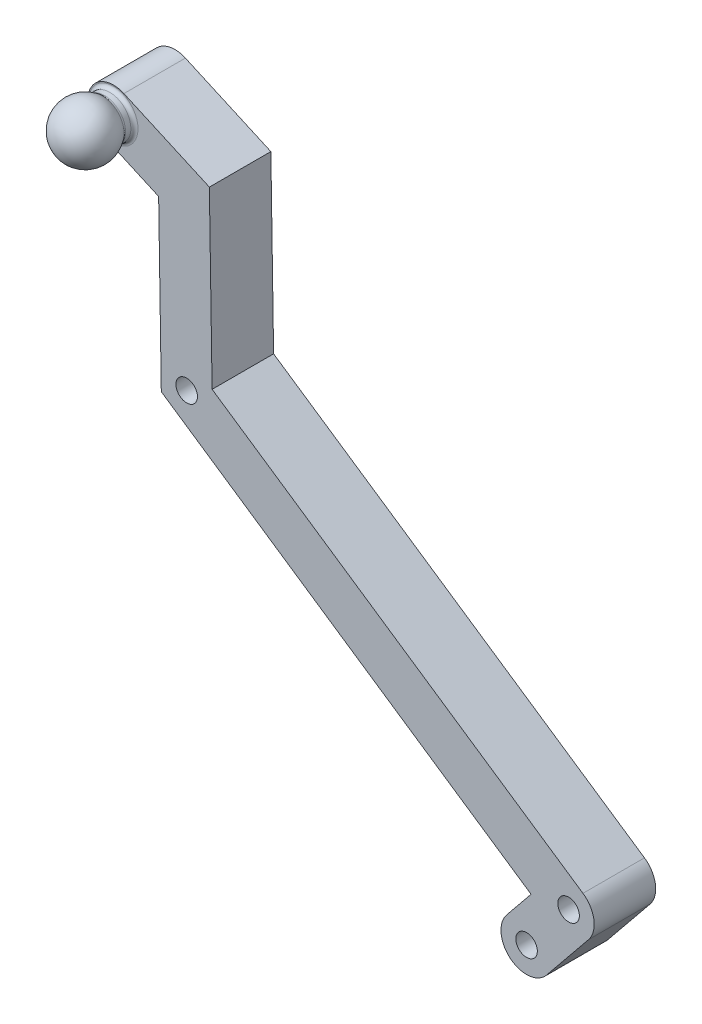
ISO-10303-21;
HEADER;
FILE_DESCRIPTION(('STEP AP214'),'2;1');
FILE_NAME('part.step','',(''),(''),'','','');
FILE_SCHEMA(('AUTOMOTIVE_DESIGN { 1 0 10303 214 1 1 1 1 }'));
ENDSEC;
DATA;
#1=APPLICATION_CONTEXT('core data for automotive mechanical design processes');
#2=APPLICATION_PROTOCOL_DEFINITION('international standard','automotive_design',2000,#1);
#3=PRODUCT_CONTEXT('',#1,'mechanical');
#4=PRODUCT('Part','Part','',(#3));
#5=PRODUCT_RELATED_PRODUCT_CATEGORY('part','',(#4));
#6=PRODUCT_DEFINITION_FORMATION('','',#4);
#7=PRODUCT_DEFINITION_CONTEXT('part definition',#1,'design');
#8=PRODUCT_DEFINITION('design','',#6,#7);
#9=PRODUCT_DEFINITION_SHAPE('','',#8);
#10=(LENGTH_UNIT() NAMED_UNIT(*) SI_UNIT(.MILLI.,.METRE.));
#11=(NAMED_UNIT(*) PLANE_ANGLE_UNIT() SI_UNIT($,.RADIAN.));
#12=(NAMED_UNIT(*) SI_UNIT($,.STERADIAN.) SOLID_ANGLE_UNIT());
#13=UNCERTAINTY_MEASURE_WITH_UNIT(LENGTH_MEASURE(1.E-05),#10,'distance_accuracy_value','');
#14=(GEOMETRIC_REPRESENTATION_CONTEXT(3) GLOBAL_UNCERTAINTY_ASSIGNED_CONTEXT((#13)) GLOBAL_UNIT_ASSIGNED_CONTEXT((#10,
#11,#12)) REPRESENTATION_CONTEXT('',''));
#15=CARTESIAN_POINT('',(0.,0.,0.));
#16=DIRECTION('',(0.,0.,1.));
#17=DIRECTION('',(1.,0.,0.));
#18=AXIS2_PLACEMENT_3D('',#15,#16,#17);
#19=CARTESIAN_POINT('',(17.5208334553325,1.65932066397215,-6.));
#20=DIRECTION('',(-0.999875655064383,-0.0157694137357801,0.));
#21=DIRECTION('',(0.0157694137357801,-0.999875655064383,0.));
#22=AXIS2_PLACEMENT_3D('',#19,#20,#21);
#23=PLANE('',#22);
#24=DIRECTION('',(0.0157694137357801,-0.999875655064383,0.));
#25=VECTOR('',#24,1.);
#26=CARTESIAN_POINT('',(17.5208334553325,1.65932066397215,0.));
#27=LINE('',#26,#25);
#28=CARTESIAN_POINT('',(17.2625853569559,18.0338029915893,0.));
#29=VERTEX_POINT('',#28);
#30=CARTESIAN_POINT('',(17.5208334553325,1.65932066397215,0.));
#31=VERTEX_POINT('',#30);
#32=EDGE_CURVE('E154',#29,#31,#27,.T.);
#33=ORIENTED_EDGE('',*,*,#32,.F.);
#34=DIRECTION('',(0.,0.,1.));
#35=VECTOR('',#34,1.);
#36=CARTESIAN_POINT('',(17.2625853569559,18.0338029915893,-6.));
#37=LINE('',#36,#35);
#38=CARTESIAN_POINT('',(17.2625853569559,18.0338029915893,-6.));
#39=VERTEX_POINT('',#38);
#40=EDGE_CURVE('E53',#39,#29,#37,.T.);
#41=ORIENTED_EDGE('',*,*,#40,.F.);
#42=DIRECTION('',(0.0157694137357801,-0.999875655064383,0.));
#43=VECTOR('',#42,1.);
#44=CARTESIAN_POINT('',(17.5208334553325,1.65932066397215,-6.));
#45=LINE('',#44,#43);
#46=CARTESIAN_POINT('',(17.5208334553325,1.65932066397215,-6.));
#47=VERTEX_POINT('',#46);
#48=EDGE_CURVE('E185',#39,#47,#45,.T.);
#49=ORIENTED_EDGE('',*,*,#48,.T.);
#50=DIRECTION('',(0.,0.,1.));
#51=VECTOR('',#50,1.);
#52=CARTESIAN_POINT('',(17.5208334553325,1.65932066397215,-6.));
#53=LINE('',#52,#51);
#54=EDGE_CURVE('E103',#47,#31,#53,.T.);
#55=ORIENTED_EDGE('',*,*,#54,.T.);
#56=EDGE_LOOP('',(#33,#41,#49,#55));
#57=FACE_BOUND('',#56,.T.);
#58=ADVANCED_FACE('F36',(#57),#23,.T.);
#59=CARTESIAN_POINT('',(17.2625853569559,18.0338029915893,-6.));
#60=DIRECTION('',(-0.408273768834411,-0.912859534474908,0.));
#61=DIRECTION('',(0.912859534474908,-0.408273768834411,0.));
#62=AXIS2_PLACEMENT_3D('',#59,#60,#61);
#63=PLANE('',#62);
#64=DIRECTION('',(0.912859534474908,-0.408273768834411,0.));
#65=VECTOR('',#64,1.);
#66=CARTESIAN_POINT('',(17.2625853569559,18.0338029915893,0.));
#67=LINE('',#66,#65);
#68=CARTESIAN_POINT('',(11.8301187262055,20.4634578745604,0.));
#69=VERTEX_POINT('',#68);
#70=EDGE_CURVE('E182',#69,#29,#67,.T.);
#71=ORIENTED_EDGE('',*,*,#70,.F.);
#72=DIRECTION('',(0.,0.,1.));
#73=VECTOR('',#72,1.);
#74=CARTESIAN_POINT('',(11.8301187262055,20.4634578745604,-6.));
#75=LINE('',#74,#73);
#76=CARTESIAN_POINT('',(11.8301187262055,20.4634578745604,-6.));
#77=VERTEX_POINT('',#76);
#78=EDGE_CURVE('E91',#77,#69,#75,.T.);
#79=ORIENTED_EDGE('',*,*,#78,.F.);
#80=DIRECTION('',(0.912859534474908,-0.408273768834411,0.));
#81=VECTOR('',#80,1.);
#82=CARTESIAN_POINT('',(17.2625853569559,18.0338029915893,-6.));
#83=LINE('',#82,#81);
#84=EDGE_CURVE('E144',#77,#39,#83,.T.);
#85=ORIENTED_EDGE('',*,*,#84,.T.);
#86=ORIENTED_EDGE('',*,*,#40,.T.);
#87=EDGE_LOOP('',(#71,#79,#85,#86));
#88=FACE_BOUND('',#87,.T.);
#89=ADVANCED_FACE('F238',(#88),#63,.T.);
#90=CARTESIAN_POINT('',(12.8508031482915,22.7456067107476,-6.));
#91=DIRECTION('',(0.,0.,1.));
#92=DIRECTION('',(1.,0.,0.));
#93=AXIS2_PLACEMENT_3D('',#90,#91,#92);
#94=CYLINDRICAL_SURFACE('',#93,2.5);
#95=CARTESIAN_POINT('',(12.8508031482915,22.7456067107476,0.));
#96=DIRECTION('',(0.,0.,1.));
#97=DIRECTION('',(-1.,0.,0.));
#98=AXIS2_PLACEMENT_3D('',#95,#96,#97);
#99=CIRCLE('',#98,2.5);
#100=CARTESIAN_POINT('',(13.8714875703776,25.0277555469349,0.));
#101=VERTEX_POINT('',#100);
#102=EDGE_CURVE('E131',#101,#69,#99,.T.);
#103=ORIENTED_EDGE('',*,*,#102,.F.);
#104=DIRECTION('',(0.,0.,1.));
#105=VECTOR('',#104,1.);
#106=CARTESIAN_POINT('',(13.8714875703776,25.0277555469349,-6.));
#107=LINE('',#106,#105);
#108=CARTESIAN_POINT('',(13.8714875703776,25.0277555469349,-6.));
#109=VERTEX_POINT('',#108);
#110=EDGE_CURVE('E126',#109,#101,#107,.T.);
#111=ORIENTED_EDGE('',*,*,#110,.F.);
#112=CARTESIAN_POINT('',(12.8508031482915,22.7456067107476,-6.));
#113=DIRECTION('',(0.,0.,1.));
#114=DIRECTION('',(-1.,0.,0.));
#115=AXIS2_PLACEMENT_3D('',#112,#113,#114);
#116=CIRCLE('',#115,2.5);
#117=EDGE_CURVE('E129',#109,#77,#116,.T.);
#118=ORIENTED_EDGE('',*,*,#117,.T.);
#119=ORIENTED_EDGE('',*,*,#78,.T.);
#120=EDGE_LOOP('',(#103,#111,#118,#119));
#121=FACE_BOUND('',#120,.T.);
#122=ADVANCED_FACE('F128',(#121),#94,.T.);
#123=CARTESIAN_POINT('',(13.8714875703776,25.0277555469349,-6.));
#124=DIRECTION('',(0.408273768834411,0.912859534474908,0.));
#125=DIRECTION('',(-0.912859534474908,0.408273768834411,0.));
#126=AXIS2_PLACEMENT_3D('',#123,#124,#125);
#127=PLANE('',#126);
#128=DIRECTION('',(-0.912859534474908,0.408273768834411,0.));
#129=VECTOR('',#128,1.);
#130=CARTESIAN_POINT('',(13.8714875703776,25.0277555469349,0.));
#131=LINE('',#130,#129);
#132=CARTESIAN_POINT('',(22.2117325096706,21.2976052820029,0.));
#133=VERTEX_POINT('',#132);
#134=EDGE_CURVE('E179',#133,#101,#131,.T.);
#135=ORIENTED_EDGE('',*,*,#134,.F.);
#136=DIRECTION('',(0.,0.,1.));
#137=VECTOR('',#136,1.);
#138=CARTESIAN_POINT('',(22.2117325096706,21.2976052820029,-6.));
#139=LINE('',#138,#137);
#140=CARTESIAN_POINT('',(22.2117325096706,21.2976052820029,-6.));
#141=VERTEX_POINT('',#140);
#142=EDGE_CURVE('E136',#141,#133,#139,.T.);
#143=ORIENTED_EDGE('',*,*,#142,.F.);
#144=DIRECTION('',(-0.912859534474908,0.408273768834411,0.));
#145=VECTOR('',#144,1.);
#146=CARTESIAN_POINT('',(13.8714875703776,25.0277555469349,-6.));
#147=LINE('',#146,#145);
#148=EDGE_CURVE('E142',#141,#109,#147,.T.);
#149=ORIENTED_EDGE('',*,*,#148,.T.);
#150=ORIENTED_EDGE('',*,*,#110,.T.);
#151=EDGE_LOOP('',(#135,#143,#149,#150));
#152=FACE_BOUND('',#151,.T.);
#153=ADVANCED_FACE('F146',(#152),#127,.T.);
#154=CARTESIAN_POINT('',(22.2117325096706,21.2976052820029,-6.));
#155=DIRECTION('',(0.999875655064383,0.01576941373578,0.));
#156=DIRECTION('',(-0.01576941373578,0.999875655064383,0.));
#157=AXIS2_PLACEMENT_3D('',#154,#155,#156);
#158=PLANE('',#157);
#159=DIRECTION('',(-0.01576941373578,0.999875655064383,0.));
#160=VECTOR('',#159,1.);
#161=CARTESIAN_POINT('',(22.2117325096706,21.2976052820029,0.));
#162=LINE('',#161,#160);
#163=CARTESIAN_POINT('',(22.4791665446676,4.34067933602787,0.));
#164=VERTEX_POINT('',#163);
#165=EDGE_CURVE('E176',#164,#133,#162,.T.);
#166=ORIENTED_EDGE('',*,*,#165,.F.);
#167=DIRECTION('',(0.,0.,1.));
#168=VECTOR('',#167,1.);
#169=CARTESIAN_POINT('',(22.4791665446676,4.34067933602787,-6.));
#170=LINE('',#169,#168);
#171=CARTESIAN_POINT('',(22.4791665446676,4.34067933602787,-6.));
#172=VERTEX_POINT('',#171);
#173=EDGE_CURVE('E190',#172,#164,#170,.T.);
#174=ORIENTED_EDGE('',*,*,#173,.F.);
#175=DIRECTION('',(-0.01576941373578,0.999875655064383,0.));
#176=VECTOR('',#175,1.);
#177=CARTESIAN_POINT('',(22.2117325096706,21.2976052820029,-6.));
#178=LINE('',#177,#176);
#179=EDGE_CURVE('E147',#172,#141,#178,.T.);
#180=ORIENTED_EDGE('',*,*,#179,.T.);
#181=ORIENTED_EDGE('',*,*,#142,.T.);
#182=EDGE_LOOP('',(#166,#174,#180,#181));
#183=FACE_BOUND('',#182,.T.);
#184=ADVANCED_FACE('F267',(#183),#158,.T.);
#185=CARTESIAN_POINT('',(22.4791665446676,4.34067933602787,-6.));
#186=DIRECTION('',(0.560587567527092,0.828095151014699,0.));
#187=DIRECTION('',(-0.828095151014699,0.560587567527092,0.));
#188=AXIS2_PLACEMENT_3D('',#185,#186,#187);
#189=PLANE('',#188);
#190=DIRECTION('',(-0.828095151014699,0.560587567527092,0.));
#191=VECTOR('',#190,1.);
#192=CARTESIAN_POINT('',(22.4791665446676,4.34067933602787,0.));
#193=LINE('',#192,#191);
#194=CARTESIAN_POINT('',(58.6657507144792,-20.1562026611824,0.));
#195=VERTEX_POINT('',#194);
#196=EDGE_CURVE('E173',#195,#164,#193,.T.);
#197=ORIENTED_EDGE('',*,*,#196,.F.);
#198=DIRECTION('',(0.,0.,1.));
#199=VECTOR('',#198,1.);
#200=CARTESIAN_POINT('',(58.6657507144792,-20.1562026611824,-6.));
#201=LINE('',#200,#199);
#202=CARTESIAN_POINT('',(58.6657507144792,-20.1562026611824,-6.));
#203=VERTEX_POINT('',#202);
#204=EDGE_CURVE('E192',#203,#195,#201,.T.);
#205=ORIENTED_EDGE('',*,*,#204,.F.);
#206=DIRECTION('',(-0.828095151014699,0.560587567527092,0.));
#207=VECTOR('',#206,1.);
#208=CARTESIAN_POINT('',(22.4791665446676,4.34067933602787,-6.));
#209=LINE('',#208,#207);
#210=EDGE_CURVE('E149',#203,#172,#209,.T.);
#211=ORIENTED_EDGE('',*,*,#210,.T.);
#212=ORIENTED_EDGE('',*,*,#173,.T.);
#213=EDGE_LOOP('',(#197,#205,#211,#212));
#214=FACE_BOUND('',#213,.T.);
#215=ADVANCED_FACE('F263',(#214),#189,.T.);
#216=CARTESIAN_POINT('',(57.2642817956615,-22.2264405387192,-6.));
#217=DIRECTION('',(0.,0.,1.));
#218=DIRECTION('',(1.,0.,0.));
#219=AXIS2_PLACEMENT_3D('',#216,#217,#218);
#220=CYLINDRICAL_SURFACE('',#219,2.50000000000002);
#221=CARTESIAN_POINT('',(57.2642817956615,-22.2264405387192,0.));
#222=DIRECTION('',(0.,0.,1.));
#223=DIRECTION('',(-1.,0.,0.));
#224=AXIS2_PLACEMENT_3D('',#221,#222,#223);
#225=CIRCLE('',#224,2.50000000000002);
#226=CARTESIAN_POINT('',(59.204495728495,-23.8030095650668,0.));
#227=VERTEX_POINT('',#226);
#228=EDGE_CURVE('E170',#227,#195,#225,.T.);
#229=ORIENTED_EDGE('',*,*,#228,.F.);
#230=DIRECTION('',(0.,0.,1.));
#231=VECTOR('',#230,1.);
#232=CARTESIAN_POINT('',(59.204495728495,-23.8030095650668,-6.));
#233=LINE('',#232,#231);
#234=CARTESIAN_POINT('',(59.204495728495,-23.8030095650668,-6.));
#235=VERTEX_POINT('',#234);
#236=EDGE_CURVE('E194',#235,#227,#233,.T.);
#237=ORIENTED_EDGE('',*,*,#236,.F.);
#238=CARTESIAN_POINT('',(57.2642817956615,-22.2264405387192,-6.));
#239=DIRECTION('',(0.,0.,1.));
#240=DIRECTION('',(-1.,0.,0.));
#241=AXIS2_PLACEMENT_3D('',#238,#239,#240);
#242=CIRCLE('',#241,2.50000000000002);
#243=EDGE_CURVE('E324',#235,#203,#242,.T.);
#244=ORIENTED_EDGE('',*,*,#243,.T.);
#245=ORIENTED_EDGE('',*,*,#204,.T.);
#246=EDGE_LOOP('',(#229,#237,#244,#245));
#247=FACE_BOUND('',#246,.T.);
#248=ADVANCED_FACE('F259',(#247),#220,.T.);
#249=CARTESIAN_POINT('',(59.204495728495,-23.8030095650668,-6.));
#250=DIRECTION('',(0.776085573133398,-0.63062761053906,0.));
#251=DIRECTION('',(0.63062761053906,0.776085573133398,0.));
#252=AXIS2_PLACEMENT_3D('',#249,#250,#251);
#253=PLANE('',#252);
#254=DIRECTION('',(0.63062761053906,0.776085573133398,0.));
#255=VECTOR('',#254,1.);
#256=CARTESIAN_POINT('',(59.204495728495,-23.8030095650668,0.));
#257=LINE('',#256,#255);
#258=CARTESIAN_POINT('',(55.1054162599911,-28.8475657904339,0.));
#259=VERTEX_POINT('',#258);
#260=EDGE_CURVE('E167',#259,#227,#257,.T.);
#261=ORIENTED_EDGE('',*,*,#260,.F.);
#262=DIRECTION('',(0.,0.,1.));
#263=VECTOR('',#262,1.);
#264=CARTESIAN_POINT('',(55.1054162599911,-28.8475657904339,-6.));
#265=LINE('',#264,#263);
#266=CARTESIAN_POINT('',(55.1054162599911,-28.8475657904339,-6.));
#267=VERTEX_POINT('',#266);
#268=EDGE_CURVE('E196',#267,#259,#265,.T.);
#269=ORIENTED_EDGE('',*,*,#268,.F.);
#270=DIRECTION('',(0.63062761053906,0.776085573133398,0.));
#271=VECTOR('',#270,1.);
#272=CARTESIAN_POINT('',(59.204495728495,-23.8030095650668,-6.));
#273=LINE('',#272,#271);
#274=EDGE_CURVE('E317',#267,#235,#273,.T.);
#275=ORIENTED_EDGE('',*,*,#274,.T.);
#276=ORIENTED_EDGE('',*,*,#236,.T.);
#277=EDGE_LOOP('',(#261,#269,#275,#276));
#278=FACE_BOUND('',#277,.T.);
#279=ADVANCED_FACE('F255',(#278),#253,.T.);
#280=CARTESIAN_POINT('',(53.1652023271576,-27.2709967640862,-6.));
#281=DIRECTION('',(0.,0.,1.));
#282=DIRECTION('',(1.,0.,0.));
#283=AXIS2_PLACEMENT_3D('',#280,#281,#282);
#284=CYLINDRICAL_SURFACE('',#283,2.5);
#285=CARTESIAN_POINT('',(53.1652023271576,-27.2709967640862,0.));
#286=DIRECTION('',(0.,0.,1.));
#287=DIRECTION('',(-1.,0.,0.));
#288=AXIS2_PLACEMENT_3D('',#285,#286,#287);
#289=CIRCLE('',#288,2.5);
#290=CARTESIAN_POINT('',(51.2249883943241,-25.6944277377386,0.));
#291=VERTEX_POINT('',#290);
#292=EDGE_CURVE('E164',#291,#259,#289,.T.);
#293=ORIENTED_EDGE('',*,*,#292,.F.);
#294=DIRECTION('',(0.,0.,1.));
#295=VECTOR('',#294,1.);
#296=CARTESIAN_POINT('',(51.2249883943241,-25.6944277377386,-6.));
#297=LINE('',#296,#295);
#298=CARTESIAN_POINT('',(51.2249883943241,-25.6944277377386,-6.));
#299=VERTEX_POINT('',#298);
#300=EDGE_CURVE('E198',#299,#291,#297,.T.);
#301=ORIENTED_EDGE('',*,*,#300,.F.);
#302=CARTESIAN_POINT('',(53.1652023271576,-27.2709967640862,-6.));
#303=DIRECTION('',(0.,0.,1.));
#304=DIRECTION('',(-1.,0.,0.));
#305=AXIS2_PLACEMENT_3D('',#302,#303,#304);
#306=CIRCLE('',#305,2.5);
#307=EDGE_CURVE('E313',#299,#267,#306,.T.);
#308=ORIENTED_EDGE('',*,*,#307,.T.);
#309=ORIENTED_EDGE('',*,*,#268,.T.);
#310=EDGE_LOOP('',(#293,#301,#308,#309));
#311=FACE_BOUND('',#310,.T.);
#312=ADVANCED_FACE('F251',(#311),#284,.T.);
#313=CARTESIAN_POINT('',(51.2249883943241,-25.6944277377386,-6.));
#314=DIRECTION('',(-0.776085573133398,0.630627610539061,0.));
#315=DIRECTION('',(-0.630627610539061,-0.776085573133398,0.));
#316=AXIS2_PLACEMENT_3D('',#313,#314,#315);
#317=PLANE('',#316);
#318=DIRECTION('',(-0.630627610539061,-0.776085573133398,0.));
#319=VECTOR('',#318,1.);
#320=CARTESIAN_POINT('',(51.2249883943241,-25.6944277377386,0.));
#321=LINE('',#320,#319);
#322=CARTESIAN_POINT('',(53.6035446818523,-22.7672434711657,0.));
#323=VERTEX_POINT('',#322);
#324=EDGE_CURVE('E161',#323,#291,#321,.T.);
#325=ORIENTED_EDGE('',*,*,#324,.F.);
#326=DIRECTION('',(0.,0.,1.));
#327=VECTOR('',#326,1.);
#328=CARTESIAN_POINT('',(53.6035446818523,-22.7672434711657,-6.));
#329=LINE('',#328,#327);
#330=CARTESIAN_POINT('',(53.6035446818523,-22.7672434711657,-6.));
#331=VERTEX_POINT('',#330);
#332=EDGE_CURVE('E200',#331,#323,#329,.T.);
#333=ORIENTED_EDGE('',*,*,#332,.F.);
#334=DIRECTION('',(-0.630627610539061,-0.776085573133398,0.));
#335=VECTOR('',#334,1.);
#336=CARTESIAN_POINT('',(51.2249883943241,-25.6944277377386,-6.));
#337=LINE('',#336,#335);
#338=EDGE_CURVE('E329',#331,#299,#337,.T.);
#339=ORIENTED_EDGE('',*,*,#338,.T.);
#340=ORIENTED_EDGE('',*,*,#300,.T.);
#341=EDGE_LOOP('',(#325,#333,#339,#340));
#342=FACE_BOUND('',#341,.T.);
#343=ADVANCED_FACE('F248',(#342),#317,.T.);
#344=CARTESIAN_POINT('',(17.5208334553325,1.65932066397215,-6.));
#345=DIRECTION('',(-0.560587567527093,-0.828095151014699,0.));
#346=DIRECTION('',(0.828095151014699,-0.560587567527093,0.));
#347=AXIS2_PLACEMENT_3D('',#344,#345,#346);
#348=PLANE('',#347);
#349=DIRECTION('',(0.828095151014699,-0.560587567527092,0.));
#350=VECTOR('',#349,1.);
#351=CARTESIAN_POINT('',(17.5208334553325,1.65932066397215,0.));
#352=LINE('',#351,#350);
#353=EDGE_CURVE('E157',#31,#323,#352,.T.);
#354=ORIENTED_EDGE('',*,*,#353,.F.);
#355=ORIENTED_EDGE('',*,*,#54,.F.);
#356=DIRECTION('',(0.828095151014699,-0.560587567527092,0.));
#357=VECTOR('',#356,1.);
#358=CARTESIAN_POINT('',(17.5208334553325,1.65932066397215,-6.));
#359=LINE('',#358,#357);
#360=EDGE_CURVE('E306',#47,#331,#359,.T.);
#361=ORIENTED_EDGE('',*,*,#360,.T.);
#362=ORIENTED_EDGE('',*,*,#332,.T.);
#363=EDGE_LOOP('',(#354,#355,#361,#362));
#364=FACE_BOUND('',#363,.T.);
#365=ADVANCED_FACE('F245',(#364),#348,.T.);
#366=CARTESIAN_POINT('',(12.8508031482915,22.7456067107476,-6.));
#367=DIRECTION('',(0.,0.,-1.));
#368=DIRECTION('',(-1.,0.,0.));
#369=AXIS2_PLACEMENT_3D('',#366,#367,#368);
#370=PLANE('',#369);
#371=CARTESIAN_POINT('',(20.,3.,-6.));
#372=DIRECTION('',(0.,0.,-1.));
#373=DIRECTION('',(-1.,0.,0.));
#374=AXIS2_PLACEMENT_3D('',#371,#372,#373);
#375=CIRCLE('',#374,1.05);
#376=CARTESIAN_POINT('',(18.95,3.,-6.));
#377=VERTEX_POINT('',#376);
#378=EDGE_CURVE('E158',#377,#377,#375,.T.);
#379=ORIENTED_EDGE('',*,*,#378,.F.);
#380=EDGE_LOOP('',(#379));
#381=FACE_BOUND('',#380,.T.);
#382=CARTESIAN_POINT('',(57.2642817956615,-22.2264405387192,-6.));
#383=DIRECTION('',(0.,0.,-1.));
#384=DIRECTION('',(-1.,0.,0.));
#385=AXIS2_PLACEMENT_3D('',#382,#383,#384);
#386=CIRCLE('',#385,1.05);
#387=CARTESIAN_POINT('',(56.2142817956615,-22.2264405387192,-6.));
#388=VERTEX_POINT('',#387);
#389=EDGE_CURVE('E210',#388,#388,#386,.T.);
#390=ORIENTED_EDGE('',*,*,#389,.F.);
#391=EDGE_LOOP('',(#390));
#392=FACE_BOUND('',#391,.T.);
#393=CARTESIAN_POINT('',(53.1652023271576,-27.2709967640862,-6.));
#394=DIRECTION('',(0.,0.,-1.));
#395=DIRECTION('',(-1.,0.,0.));
#396=AXIS2_PLACEMENT_3D('',#393,#394,#395);
#397=CIRCLE('',#396,1.05);
#398=CARTESIAN_POINT('',(52.1152023271576,-27.2709967640862,-6.));
#399=VERTEX_POINT('',#398);
#400=EDGE_CURVE('E206',#399,#399,#397,.T.);
#401=ORIENTED_EDGE('',*,*,#400,.F.);
#402=EDGE_LOOP('',(#401));
#403=FACE_BOUND('',#402,.T.);
#404=ORIENTED_EDGE('',*,*,#48,.F.);
#405=ORIENTED_EDGE('',*,*,#84,.F.);
#406=ORIENTED_EDGE('',*,*,#117,.F.);
#407=ORIENTED_EDGE('',*,*,#148,.F.);
#408=ORIENTED_EDGE('',*,*,#179,.F.);
#409=ORIENTED_EDGE('',*,*,#210,.F.);
#410=ORIENTED_EDGE('',*,*,#243,.F.);
#411=ORIENTED_EDGE('',*,*,#274,.F.);
#412=ORIENTED_EDGE('',*,*,#307,.F.);
#413=ORIENTED_EDGE('',*,*,#338,.F.);
#414=ORIENTED_EDGE('',*,*,#360,.F.);
#415=EDGE_LOOP('',(#404,#405,#406,#407,#408,#409,#410,#411,#412,#413,#414));
#416=FACE_BOUND('',#415,.T.);
#417=ADVANCED_FACE('F140',(#381,#392,#403,#416),#370,.T.);
#418=CARTESIAN_POINT('',(12.8508031482915,22.7456067107476,0.));
#419=DIRECTION('',(0.,0.,-1.));
#420=DIRECTION('',(-1.,0.,0.));
#421=AXIS2_PLACEMENT_3D('',#418,#419,#420);
#422=PLANE('',#421);
#423=CARTESIAN_POINT('',(12.8508031482915,22.7456067107476,0.));
#424=DIRECTION('',(0.,0.,-1.));
#425=DIRECTION('',(-1.,0.,0.));
#426=AXIS2_PLACEMENT_3D('',#423,#424,#425);
#427=CIRCLE('',#426,2.4);
#428=CARTESIAN_POINT('',(10.4508031482915,22.7456067107476,0.));
#429=VERTEX_POINT('',#428);
#430=EDGE_CURVE('E11',#429,#429,#427,.T.);
#431=ORIENTED_EDGE('',*,*,#430,.T.);
#432=EDGE_LOOP('',(#431));
#433=FACE_BOUND('',#432,.T.);
#434=CARTESIAN_POINT('',(20.,3.,0.));
#435=DIRECTION('',(0.,0.,-1.));
#436=DIRECTION('',(-1.,0.,0.));
#437=AXIS2_PLACEMENT_3D('',#434,#435,#436);
#438=CIRCLE('',#437,1.05);
#439=CARTESIAN_POINT('',(18.95,3.,0.));
#440=VERTEX_POINT('',#439);
#441=EDGE_CURVE('E211',#440,#440,#438,.T.);
#442=ORIENTED_EDGE('',*,*,#441,.T.);
#443=EDGE_LOOP('',(#442));
#444=FACE_BOUND('',#443,.T.);
#445=CARTESIAN_POINT('',(57.2642817956615,-22.2264405387192,0.));
#446=DIRECTION('',(0.,0.,-1.));
#447=DIRECTION('',(-1.,0.,0.));
#448=AXIS2_PLACEMENT_3D('',#445,#446,#447);
#449=CIRCLE('',#448,1.05);
#450=CARTESIAN_POINT('',(56.2142817956615,-22.2264405387192,0.));
#451=VERTEX_POINT('',#450);
#452=EDGE_CURVE('E207',#451,#451,#449,.T.);
#453=ORIENTED_EDGE('',*,*,#452,.T.);
#454=EDGE_LOOP('',(#453));
#455=FACE_BOUND('',#454,.T.);
#456=CARTESIAN_POINT('',(53.1652023271576,-27.2709967640862,0.));
#457=DIRECTION('',(0.,0.,-1.));
#458=DIRECTION('',(-1.,0.,0.));
#459=AXIS2_PLACEMENT_3D('',#456,#457,#458);
#460=CIRCLE('',#459,1.05);
#461=CARTESIAN_POINT('',(52.1152023271576,-27.2709967640862,0.));
#462=VERTEX_POINT('',#461);
#463=EDGE_CURVE('E203',#462,#462,#460,.T.);
#464=ORIENTED_EDGE('',*,*,#463,.T.);
#465=EDGE_LOOP('',(#464));
#466=FACE_BOUND('',#465,.T.);
#467=ORIENTED_EDGE('',*,*,#32,.T.);
#468=ORIENTED_EDGE('',*,*,#353,.T.);
#469=ORIENTED_EDGE('',*,*,#324,.T.);
#470=ORIENTED_EDGE('',*,*,#292,.T.);
#471=ORIENTED_EDGE('',*,*,#260,.T.);
#472=ORIENTED_EDGE('',*,*,#228,.T.);
#473=ORIENTED_EDGE('',*,*,#196,.T.);
#474=ORIENTED_EDGE('',*,*,#165,.T.);
#475=ORIENTED_EDGE('',*,*,#134,.T.);
#476=ORIENTED_EDGE('',*,*,#102,.T.);
#477=ORIENTED_EDGE('',*,*,#70,.T.);
#478=EDGE_LOOP('',(#467,#468,#469,#470,#471,#472,#473,#474,#475,#476,#477));
#479=FACE_BOUND('',#478,.T.);
#480=ADVANCED_FACE('F276',(#433,#444,#455,#466,#479),#422,.F.);
#481=CARTESIAN_POINT('',(53.1652023271576,-27.2709967640862,-11.));
#482=DIRECTION('',(0.,0.,1.));
#483=DIRECTION('',(1.,0.,0.));
#484=AXIS2_PLACEMENT_3D('',#481,#482,#483);
#485=CYLINDRICAL_SURFACE('',#484,1.05);
#486=ORIENTED_EDGE('',*,*,#400,.T.);
#487=EDGE_LOOP('',(#486));
#488=FACE_BOUND('',#487,.T.);
#489=ORIENTED_EDGE('',*,*,#463,.F.);
#490=EDGE_LOOP('',(#489));
#491=FACE_BOUND('',#490,.T.);
#492=ADVANCED_FACE('F279',(#488,#491),#485,.F.);
#493=CARTESIAN_POINT('',(57.2642817956615,-22.2264405387192,-11.));
#494=DIRECTION('',(0.,0.,1.));
#495=DIRECTION('',(1.,0.,0.));
#496=AXIS2_PLACEMENT_3D('',#493,#494,#495);
#497=CYLINDRICAL_SURFACE('',#496,1.05);
#498=ORIENTED_EDGE('',*,*,#389,.T.);
#499=EDGE_LOOP('',(#498));
#500=FACE_BOUND('',#499,.T.);
#501=ORIENTED_EDGE('',*,*,#452,.F.);
#502=EDGE_LOOP('',(#501));
#503=FACE_BOUND('',#502,.T.);
#504=ADVANCED_FACE('F286',(#500,#503),#497,.F.);
#505=CARTESIAN_POINT('',(20.,3.,-11.));
#506=DIRECTION('',(0.,0.,1.));
#507=DIRECTION('',(1.,0.,0.));
#508=AXIS2_PLACEMENT_3D('',#505,#506,#507);
#509=CYLINDRICAL_SURFACE('',#508,1.05);
#510=ORIENTED_EDGE('',*,*,#378,.T.);
#511=EDGE_LOOP('',(#510));
#512=FACE_BOUND('',#511,.T.);
#513=ORIENTED_EDGE('',*,*,#441,.F.);
#514=EDGE_LOOP('',(#513));
#515=FACE_BOUND('',#514,.T.);
#516=ADVANCED_FACE('F235',(#512,#515),#509,.F.);
#517=CARTESIAN_POINT('',(12.8508031482915,22.7456067107476,2.));
#518=DIRECTION('',(0.,0.,-1.));
#519=DIRECTION('',(-1.,0.,0.));
#520=AXIS2_PLACEMENT_3D('',#517,#518,#519);
#521=CYLINDRICAL_SURFACE('',#520,2.05);
#522=CARTESIAN_POINT('',(12.8508031482915,22.7456067107476,0.867846977528129));
#523=DIRECTION('',(0.,0.,1.));
#524=DIRECTION('',(1.,0.,0.));
#525=AXIS2_PLACEMENT_3D('',#522,#523,#524);
#526=CIRCLE('',#525,2.05);
#527=CARTESIAN_POINT('',(14.9008031482915,22.7456067107476,0.867846977528129));
#528=VERTEX_POINT('',#527);
#529=EDGE_CURVE('E45',#528,#528,#526,.F.);
#530=ORIENTED_EDGE('',*,*,#529,.T.);
#531=EDGE_LOOP('',(#530));
#532=FACE_BOUND('',#531,.T.);
#533=CARTESIAN_POINT('',(12.8508031482915,22.7456067107476,0.35));
#534=DIRECTION('',(0.,0.,-1.));
#535=DIRECTION('',(-1.,0.,0.));
#536=AXIS2_PLACEMENT_3D('',#533,#534,#535);
#537=CIRCLE('',#536,2.05);
#538=CARTESIAN_POINT('',(10.8008031482915,22.7456067107476,0.35));
#539=VERTEX_POINT('',#538);
#540=EDGE_CURVE('E216',#539,#539,#537,.F.);
#541=ORIENTED_EDGE('',*,*,#540,.T.);
#542=EDGE_LOOP('',(#541));
#543=FACE_BOUND('',#542,.T.);
#544=ADVANCED_FACE('F221',(#532,#543),#521,.T.);
#545=CARTESIAN_POINT('',(12.8508031482915,22.7456067107476,2.75));
#546=DIRECTION('',(0.,0.,-1.));
#547=DIRECTION('',(0.,-1.,0.));
#548=AXIS2_PLACEMENT_3D('',#545,#546,#547);
#549=SPHERICAL_SURFACE('',#548,2.7);
#550=CARTESIAN_POINT('',(12.8508031482915,22.7456067107476,1.08383175059867));
#551=DIRECTION('',(0.,0.,1.));
#552=DIRECTION('',(1.,0.,0.));
#553=AXIS2_PLACEMENT_3D('',#550,#551,#552);
#554=CIRCLE('',#553,2.12459016393443);
#555=CARTESIAN_POINT('',(14.975393312226,22.7456067107476,1.08383175059867));
#556=VERTEX_POINT('',#555);
#557=EDGE_CURVE('E187',#556,#556,#554,.T.);
#558=ORIENTED_EDGE('',*,*,#557,.T.);
#559=EDGE_LOOP('',(#558));
#560=FACE_BOUND('',#559,.T.);
#561=ADVANCED_FACE('F227',(#560),#549,.T.);
#562=CARTESIAN_POINT('',(12.8508031482915,22.7456067107476,0.867846977528129));
#563=DIRECTION('',(0.,0.,1.));
#564=DIRECTION('',(1.,0.,0.));
#565=AXIS2_PLACEMENT_3D('',#562,#563,#564);
#566=TOROIDAL_SURFACE('',#565,2.4,0.35);
#567=ORIENTED_EDGE('',*,*,#529,.F.);
#568=EDGE_LOOP('',(#567));
#569=FACE_BOUND('',#568,.T.);
#570=ORIENTED_EDGE('',*,*,#557,.F.);
#571=EDGE_LOOP('',(#570));
#572=FACE_BOUND('',#571,.T.);
#573=ADVANCED_FACE('F224',(#569,#572),#566,.F.);
#574=CARTESIAN_POINT('',(12.8508031482915,22.7456067107476,0.35));
#575=DIRECTION('',(0.,0.,-1.));
#576=DIRECTION('',(-1.,0.,0.));
#577=AXIS2_PLACEMENT_3D('',#574,#575,#576);
#578=TOROIDAL_SURFACE('',#577,2.4,0.35);
#579=ORIENTED_EDGE('',*,*,#540,.F.);
#580=EDGE_LOOP('',(#579));
#581=FACE_BOUND('',#580,.T.);
#582=ORIENTED_EDGE('',*,*,#430,.F.);
#583=EDGE_LOOP('',(#582));
#584=FACE_BOUND('',#583,.T.);
#585=ADVANCED_FACE('F38',(#581,#584),#578,.F.);
#586=CLOSED_SHELL('',(#58,#89,#122,#153,#184,#215,#248,#279,#312,#343,#365,#417,#480,#492,#504,
#516,#544,#561,#573,#585));
#587=MANIFOLD_SOLID_BREP('B2',#586);
#588=ADVANCED_BREP_SHAPE_REPRESENTATION('',(#18,#587),#14);
#589=SHAPE_DEFINITION_REPRESENTATION(#9,#588);
ENDSEC;
END-ISO-10303-21;
